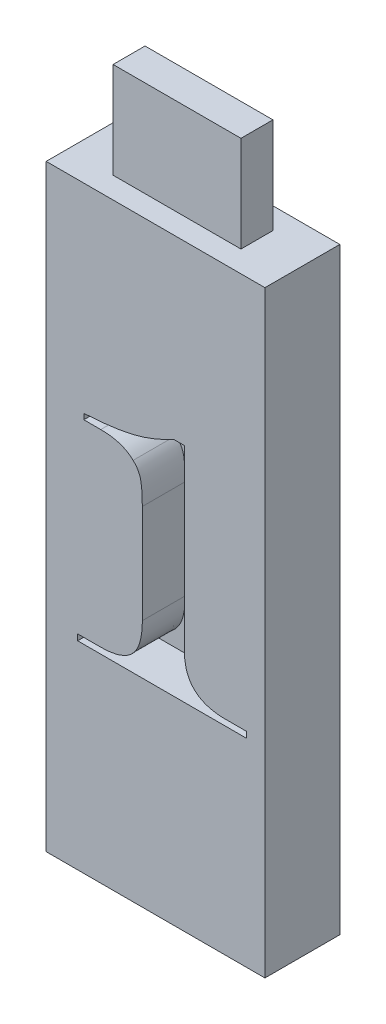
ISO-10303-21;
HEADER;
FILE_DESCRIPTION(('STEP AP214'),'2;1');
FILE_NAME('part.step','',(''),(''),'','','');
FILE_SCHEMA(('AUTOMOTIVE_DESIGN { 1 0 10303 214 1 1 1 1 }'));
ENDSEC;
DATA;
#1=APPLICATION_CONTEXT('core data for automotive mechanical design processes');
#2=APPLICATION_PROTOCOL_DEFINITION('international standard','automotive_design',2000,#1);
#3=PRODUCT_CONTEXT('',#1,'mechanical');
#4=PRODUCT('Part','Part','',(#3));
#5=PRODUCT_RELATED_PRODUCT_CATEGORY('part','',(#4));
#6=PRODUCT_DEFINITION_FORMATION('','',#4);
#7=PRODUCT_DEFINITION_CONTEXT('part definition',#1,'design');
#8=PRODUCT_DEFINITION('design','',#6,#7);
#9=PRODUCT_DEFINITION_SHAPE('','',#8);
#10=(LENGTH_UNIT() NAMED_UNIT(*) SI_UNIT(.MILLI.,.METRE.));
#11=(NAMED_UNIT(*) PLANE_ANGLE_UNIT() SI_UNIT($,.RADIAN.));
#12=(NAMED_UNIT(*) SI_UNIT($,.STERADIAN.) SOLID_ANGLE_UNIT());
#13=UNCERTAINTY_MEASURE_WITH_UNIT(LENGTH_MEASURE(1.E-05),#10,'distance_accuracy_value','');
#14=(GEOMETRIC_REPRESENTATION_CONTEXT(3) GLOBAL_UNCERTAINTY_ASSIGNED_CONTEXT((#13)) GLOBAL_UNIT_ASSIGNED_CONTEXT((#10,
#11,#12)) REPRESENTATION_CONTEXT('',''));
#15=CARTESIAN_POINT('',(0.,0.,0.));
#16=DIRECTION('',(0.,0.,1.));
#17=DIRECTION('',(1.,0.,0.));
#18=AXIS2_PLACEMENT_3D('',#15,#16,#17);
#19=CARTESIAN_POINT('',(-8.69,23.749,5.95));
#20=DIRECTION('',(0.,-1.,0.));
#21=DIRECTION('',(0.,0.,-1.));
#22=AXIS2_PLACEMENT_3D('',#19,#20,#21);
#23=PLANE('',#22);
#24=DIRECTION('',(-1.,0.,0.));
#25=VECTOR('',#24,1.);
#26=CARTESIAN_POINT('',(-8.69,23.749,0.));
#27=LINE('',#26,#25);
#28=CARTESIAN_POINT('',(8.69,23.749,0.));
#29=VERTEX_POINT('',#28);
#30=CARTESIAN_POINT('',(-8.69,23.749,0.));
#31=VERTEX_POINT('',#30);
#32=EDGE_CURVE('E284',#29,#31,#27,.T.);
#33=ORIENTED_EDGE('',*,*,#32,.T.);
#34=DIRECTION('',(0.,0.,-1.));
#35=VECTOR('',#34,1.);
#36=CARTESIAN_POINT('',(-8.69,23.749,5.95));
#37=LINE('',#36,#35);
#38=CARTESIAN_POINT('',(-8.69,23.749,5.95));
#39=VERTEX_POINT('',#38);
#40=EDGE_CURVE('E48',#39,#31,#37,.T.);
#41=ORIENTED_EDGE('',*,*,#40,.F.);
#42=DIRECTION('',(-1.,0.,0.));
#43=VECTOR('',#42,1.);
#44=CARTESIAN_POINT('',(-8.69,23.749,5.95));
#45=LINE('',#44,#43);
#46=CARTESIAN_POINT('',(8.69,23.749,5.95));
#47=VERTEX_POINT('',#46);
#48=EDGE_CURVE('E322',#47,#39,#45,.T.);
#49=ORIENTED_EDGE('',*,*,#48,.F.);
#50=DIRECTION('',(0.,0.,-1.));
#51=VECTOR('',#50,1.);
#52=CARTESIAN_POINT('',(8.69,23.749,5.95));
#53=LINE('',#52,#51);
#54=EDGE_CURVE('E11',#47,#29,#53,.T.);
#55=ORIENTED_EDGE('',*,*,#54,.T.);
#56=EDGE_LOOP('',(#33,#41,#49,#55));
#57=FACE_BOUND('',#56,.T.);
#58=DIRECTION('',(0.,0.,-1.));
#59=VECTOR('',#58,1.);
#60=CARTESIAN_POINT('',(5.08,23.749,4.245));
#61=LINE('',#60,#59);
#62=CARTESIAN_POINT('',(5.08,23.749,4.245));
#63=VERTEX_POINT('',#62);
#64=CARTESIAN_POINT('',(5.08,23.749,1.705));
#65=VERTEX_POINT('',#64);
#66=EDGE_CURVE('E55',#63,#65,#61,.T.);
#67=ORIENTED_EDGE('',*,*,#66,.F.);
#68=DIRECTION('',(1.,0.,0.));
#69=VECTOR('',#68,1.);
#70=CARTESIAN_POINT('',(-5.08,23.749,4.245));
#71=LINE('',#70,#69);
#72=CARTESIAN_POINT('',(-5.08,23.749,4.245));
#73=VERTEX_POINT('',#72);
#74=EDGE_CURVE('E59',#73,#63,#71,.T.);
#75=ORIENTED_EDGE('',*,*,#74,.F.);
#76=DIRECTION('',(0.,0.,1.));
#77=VECTOR('',#76,1.);
#78=CARTESIAN_POINT('',(-5.08,23.749,4.245));
#79=LINE('',#78,#77);
#80=CARTESIAN_POINT('',(-5.08,23.749,1.705));
#81=VERTEX_POINT('',#80);
#82=EDGE_CURVE('E787',#81,#73,#79,.T.);
#83=ORIENTED_EDGE('',*,*,#82,.F.);
#84=DIRECTION('',(-1.,0.,0.));
#85=VECTOR('',#84,1.);
#86=CARTESIAN_POINT('',(-5.08,23.749,1.705));
#87=LINE('',#86,#85);
#88=EDGE_CURVE('E797',#65,#81,#87,.T.);
#89=ORIENTED_EDGE('',*,*,#88,.F.);
#90=EDGE_LOOP('',(#67,#75,#83,#89));
#91=FACE_BOUND('',#90,.T.);
#92=ADVANCED_FACE('F39',(#57,#91),#23,.F.);
#93=CARTESIAN_POINT('',(0.,0.,5.95));
#94=DIRECTION('',(0.,0.,-1.));
#95=DIRECTION('',(-1.,0.,0.));
#96=AXIS2_PLACEMENT_3D('',#93,#94,#95);
#97=PLANE('',#96);
#98=DIRECTION('',(0.,1.,0.));
#99=VECTOR('',#98,1.);
#100=CARTESIAN_POINT('',(8.69,-23.749,5.95));
#101=LINE('',#100,#99);
#102=CARTESIAN_POINT('',(8.69,-23.749,5.95));
#103=VERTEX_POINT('',#102);
#104=EDGE_CURVE('E305',#103,#47,#101,.T.);
#105=ORIENTED_EDGE('',*,*,#104,.T.);
#106=ORIENTED_EDGE('',*,*,#48,.T.);
#107=DIRECTION('',(0.,-1.,0.));
#108=VECTOR('',#107,1.);
#109=CARTESIAN_POINT('',(-8.69,-23.749,5.95));
#110=LINE('',#109,#108);
#111=CARTESIAN_POINT('',(-8.69,-23.749,5.95));
#112=VERTEX_POINT('',#111);
#113=EDGE_CURVE('E297',#39,#112,#110,.T.);
#114=ORIENTED_EDGE('',*,*,#113,.T.);
#115=DIRECTION('',(1.,0.,0.));
#116=VECTOR('',#115,1.);
#117=CARTESIAN_POINT('',(-8.69,-23.749,5.95));
#118=LINE('',#117,#116);
#119=EDGE_CURVE('E313',#112,#103,#118,.T.);
#120=ORIENTED_EDGE('',*,*,#119,.T.);
#121=EDGE_LOOP('',(#105,#106,#114,#120));
#122=FACE_BOUND('',#121,.T.);
#123=DIRECTION('',(0.,1.,0.));
#124=VECTOR('',#123,1.);
#125=CARTESIAN_POINT('',(-6.18915076453345,-7.98771360499018,5.95));
#126=LINE('',#125,#124);
#127=CARTESIAN_POINT('',(-6.18915076453345,-7.98771360499018,5.95));
#128=VERTEX_POINT('',#127);
#129=CARTESIAN_POINT('',(-6.18915076453345,-7.51005577137531,5.95));
#130=VERTEX_POINT('',#129);
#131=EDGE_CURVE('E218',#128,#130,#126,.T.);
#132=ORIENTED_EDGE('',*,*,#131,.T.);
#133=DIRECTION('',(1.,0.,0.));
#134=VECTOR('',#133,1.);
#135=CARTESIAN_POINT('',(-6.18915076453345,-7.51005577137531,5.95));
#136=LINE('',#135,#134);
#137=CARTESIAN_POINT('',(-4.37554367752701,-7.51005577137531,5.95));
#138=VERTEX_POINT('',#137);
#139=EDGE_CURVE('E223',#130,#138,#136,.T.);
#140=ORIENTED_EDGE('',*,*,#139,.T.);
#141=CARTESIAN_POINT('',(-4.37554367752701,-7.51005577137531,5.95));
#142=CARTESIAN_POINT('',(-4.23610003430564,-7.50874102846015,5.95));
#143=CARTESIAN_POINT('',(-3.96525968570146,-7.50618741309811,5.95));
#144=CARTESIAN_POINT('',(-3.57515773941497,-7.46288098301774,5.95));
#145=CARTESIAN_POINT('',(-3.21292964680105,-7.40101134089906,5.95));
#146=CARTESIAN_POINT('',(-2.87995214816045,-7.31261869579678,5.95));
#147=CARTESIAN_POINT('',(-2.576880198355,-7.19594041634851,5.95));
#148=CARTESIAN_POINT('',(-2.29978761363573,-7.05947513325591,5.95));
#149=CARTESIAN_POINT('',(-2.05722729753765,-6.88939866376993,5.95));
#150=CARTESIAN_POINT('',(-1.83988617582516,-6.69689627341764,5.95));
#151=CARTESIAN_POINT('',(-1.65061730047412,-6.47374839688271,5.95));
#152=CARTESIAN_POINT('',(-1.49147228997212,-6.21688447837659,5.95));
#153=CARTESIAN_POINT('',(-1.35158271352618,-5.9313960282205,5.95));
#154=CARTESIAN_POINT('',(-1.24036571081079,-5.61174215076235,5.95));
#155=CARTESIAN_POINT('',(-1.15676772053177,-5.260026908282,5.95));
#156=CARTESIAN_POINT('',(-1.0930190540138,-4.87864815766317,5.95));
#157=CARTESIAN_POINT('',(-1.05562282296083,-4.46573757897142,5.95));
#158=CARTESIAN_POINT('',(-1.05231376730954,-4.18021236020088,5.95));
#159=CARTESIAN_POINT('',(-1.05059735134854,-4.03210967036708,5.95));
#160=B_SPLINE_CURVE_WITH_KNOTS('',3,(#141,#142,#143,#144,#145,#146,#147,#148,#149,#150,#151,
#152,#153,#154,#155,#156,#157,#158,#159),.UNSPECIFIED.,.F.,.F.,(4,1,1,1,1,1,1,1,1,1,1,1,1,1,1,1,
4),(0.,0.0750169889204133,0.145704938289554,0.210982199441047,0.272701169893458,
0.330771263795377,0.385568472334618,0.438501394808148,0.489712458530425,0.541493736534247,
0.595362705983791,0.651958867891753,0.712311685274751,0.777106425736709,0.846343012080092,
0.920297711982541,1.),.UNSPECIFIED.);
#161=CARTESIAN_POINT('',(-1.05059735134854,-4.03210967036708,5.95));
#162=VERTEX_POINT('',#161);
#163=EDGE_CURVE('E594',#138,#162,#160,.T.);
#164=ORIENTED_EDGE('',*,*,#163,.T.);
#165=DIRECTION('',(0.,1.,0.));
#166=VECTOR('',#165,1.);
#167=CARTESIAN_POINT('',(-1.05059735134854,-4.03210967036708,5.95));
#168=LINE('',#167,#166);
#169=CARTESIAN_POINT('',(-1.05059735134854,3.82312267150238,5.95));
#170=VERTEX_POINT('',#169);
#171=EDGE_CURVE('E600',#162,#170,#168,.T.);
#172=ORIENTED_EDGE('',*,*,#171,.T.);
#173=CARTESIAN_POINT('',(-1.05059735134854,3.82312267150238,5.95));
#174=CARTESIAN_POINT('',(-1.05099070588758,4.01847681535995,5.95));
#175=CARTESIAN_POINT('',(-1.05172286109474,4.38209167033187,5.95));
#176=CARTESIAN_POINT('',(-1.08281934121119,4.88372969077205,5.95));
#177=CARTESIAN_POINT('',(-1.12362186760334,5.30054430180468,5.95));
#178=CARTESIAN_POINT('',(-1.18631223309802,5.64251246196481,5.95));
#179=CARTESIAN_POINT('',(-1.27784933856357,5.93419420529454,5.95));
#180=CARTESIAN_POINT('',(-1.40985925874961,6.19089899772735,5.95));
#181=CARTESIAN_POINT('',(-1.57602629633835,6.42838762660998,5.95));
#182=CARTESIAN_POINT('',(-1.71261544534873,6.56412926713396,5.95));
#183=CARTESIAN_POINT('',(-1.7820109090713,6.63309414581483,5.95));
#184=B_SPLINE_CURVE_WITH_KNOTS('',3,(#173,#174,#175,#176,#177,#178,#179,#180,#181,#182,#183),
.UNSPECIFIED.,.F.,.F.,(4,1,1,1,1,1,1,1,4),(0.,0.195476440494539,0.363842487071439,
0.502839566722221,0.614422665441608,0.711274754792311,0.807597286873265,0.902247904788573,1.),.UNSPECIFIED.);
#185=CARTESIAN_POINT('',(-1.7820109090713,6.63309414581483,5.95));
#186=VERTEX_POINT('',#185);
#187=EDGE_CURVE('E607',#170,#186,#184,.T.);
#188=ORIENTED_EDGE('',*,*,#187,.T.);
#189=CARTESIAN_POINT('',(-1.7820109090713,6.63309414581483,5.95));
#190=CARTESIAN_POINT('',(-1.85786908165485,6.69933454417018,5.95));
#191=CARTESIAN_POINT('',(-2.01068954560201,6.83277947256678,5.95));
#192=CARTESIAN_POINT('',(-2.26657065487001,7.00693233106887,5.95));
#193=CARTESIAN_POINT('',(-2.55272251106501,7.14773373539934,5.95));
#194=CARTESIAN_POINT('',(-2.8637657441885,7.26143162650499,5.95));
#195=CARTESIAN_POINT('',(-3.1983525879004,7.35833861437856,5.95));
#196=CARTESIAN_POINT('',(-3.56050980183189,7.41658275676326,5.95));
#197=CARTESIAN_POINT('',(-3.94775190459175,7.46185027267119,5.95));
#198=CARTESIAN_POINT('',(-4.21492627116966,7.46409981427025,5.95));
#199=CARTESIAN_POINT('',(-4.35315346657631,7.46526365281573,5.95));
#200=B_SPLINE_CURVE_WITH_KNOTS('',3,(#189,#190,#191,#192,#193,#194,#195,#196,#197,#198,#199),
.UNSPECIFIED.,.F.,.F.,(4,1,1,1,1,1,1,1,4),(0.,0.109036045176578,0.219659114415069,
0.334153543090579,0.453538768546203,0.578104103389299,0.71079980205562,0.850377366717769,1.),.UNSPECIFIED.);
#201=CARTESIAN_POINT('',(-4.35315346657631,7.46526365281573,5.95));
#202=VERTEX_POINT('',#201);
#203=EDGE_CURVE('E613',#186,#202,#200,.T.);
#204=ORIENTED_EDGE('',*,*,#203,.T.);
#205=DIRECTION('',(-1.,0.,0.));
#206=VECTOR('',#205,1.);
#207=CARTESIAN_POINT('',(-4.35315346657631,7.46526365281573,5.95));
#208=LINE('',#207,#206);
#209=CARTESIAN_POINT('',(-5.70029782544324,7.46526365281573,5.95));
#210=VERTEX_POINT('',#209);
#211=EDGE_CURVE('E622',#202,#210,#208,.T.);
#212=ORIENTED_EDGE('',*,*,#211,.T.);
#213=DIRECTION('',(0.,1.,0.));
#214=VECTOR('',#213,1.);
#215=CARTESIAN_POINT('',(-5.70029782544324,7.46526365281573,5.95));
#216=LINE('',#215,#214);
#217=CARTESIAN_POINT('',(-5.70029782544324,7.90933617000454,5.95));
#218=VERTEX_POINT('',#217);
#219=EDGE_CURVE('E629',#210,#218,#216,.T.);
#220=ORIENTED_EDGE('',*,*,#219,.T.);
#221=CARTESIAN_POINT('',(-5.70029782544324,7.90933617000454,5.95));
#222=CARTESIAN_POINT('',(-5.45143047737275,7.9229585992943,5.95));
#223=CARTESIAN_POINT('',(-4.9669659583837,7.94947707873523,5.95));
#224=CARTESIAN_POINT('',(-4.25899913030741,8.01002373821412,5.95));
#225=CARTESIAN_POINT('',(-3.58940796363513,8.08356334657333,5.95));
#226=CARTESIAN_POINT('',(-2.95443418659469,8.17279995438616,5.95));
#227=CARTESIAN_POINT('',(-2.35298840335099,8.28028574755233,5.95));
#228=CARTESIAN_POINT('',(-1.78214454984667,8.40826926657247,5.95));
#229=CARTESIAN_POINT('',(-1.23801095244961,8.54797874094322,5.95));
#230=CARTESIAN_POINT('',(-0.715430391819257,8.71553333176158,5.95));
#231=CARTESIAN_POINT('',(-0.195727601763085,8.91037522080877,5.95));
#232=CARTESIAN_POINT('',(0.33741676027381,9.13230690572563,5.95));
#233=CARTESIAN_POINT('',(0.886154118734322,9.39705878987949,5.95));
#234=CARTESIAN_POINT('',(1.25603834429261,9.58774249305935,5.95));
#235=CARTESIAN_POINT('',(1.44591116965416,9.68562623875982,5.95));
#236=B_SPLINE_CURVE_WITH_KNOTS('',3,(#221,#222,#223,#224,#225,#226,#227,#228,#229,#230,#231,
#232,#233,#234,#235),.UNSPECIFIED.,.F.,.F.,(4,1,1,1,1,1,1,1,1,1,1,1,4),(0.,0.100545978385056,
0.195730614852711,0.286615425000165,0.372275174389162,0.454369599448173,0.533022142066202,
0.608244380805138,0.680931444364636,0.754290991819458,0.832113082458704,0.913818537877107,1.),.UNSPECIFIED.);
#237=CARTESIAN_POINT('',(1.44591116965416,9.68562623875982,5.95));
#238=VERTEX_POINT('',#237);
#239=EDGE_CURVE('E633',#218,#238,#236,.T.);
#240=ORIENTED_EDGE('',*,*,#239,.T.);
#241=DIRECTION('',(1.,0.,0.));
#242=VECTOR('',#241,1.);
#243=CARTESIAN_POINT('',(1.44591116965416,9.68562623875982,5.95));
#244=LINE('',#243,#242);
#245=CARTESIAN_POINT('',(2.29300748395552,9.68562623875982,5.95));
#246=VERTEX_POINT('',#245);
#247=EDGE_CURVE('E639',#238,#246,#244,.T.);
#248=ORIENTED_EDGE('',*,*,#247,.T.);
#249=DIRECTION('',(0.,-1.,0.));
#250=VECTOR('',#249,1.);
#251=CARTESIAN_POINT('',(2.29300748395552,9.68562623875982,5.95));
#252=LINE('',#251,#250);
#253=CARTESIAN_POINT('',(2.29300748395552,-4.45752367843031,5.95));
#254=VERTEX_POINT('',#253);
#255=EDGE_CURVE('E646',#246,#254,#252,.T.);
#256=ORIENTED_EDGE('',*,*,#255,.T.);
#257=CARTESIAN_POINT('',(2.29300748395552,-4.45752367843031,5.95));
#258=CARTESIAN_POINT('',(2.29431731137845,-4.58081526710359,5.95));
#259=CARTESIAN_POINT('',(2.29686559135136,-4.82068006207079,5.95));
#260=CARTESIAN_POINT('',(2.34058462423329,-5.16726640645375,5.95));
#261=CARTESIAN_POINT('',(2.40232489771927,-5.49108335297564,5.95));
#262=CARTESIAN_POINT('',(2.49085280621763,-5.790612797527,5.95));
#263=CARTESIAN_POINT('',(2.60846598670943,-6.0646716034722,5.95));
#264=CARTESIAN_POINT('',(2.74585186833221,-6.31865292130383,5.95));
#265=CARTESIAN_POINT('',(2.91446779534326,-6.5469008701421,5.95));
#266=CARTESIAN_POINT('',(3.11089720268626,-6.74900946449629,5.95));
#267=CARTESIAN_POINT('',(3.32916805728572,-6.93021895527735,5.95));
#268=CARTESIAN_POINT('',(3.57280886211807,-7.08810541957417,5.95));
#269=CARTESIAN_POINT('',(3.84456582059356,-7.21780194668013,5.95));
#270=CARTESIAN_POINT('',(4.14019436166815,-7.32714773974292,5.95));
#271=CARTESIAN_POINT('',(4.462230563453,-7.407047665968,5.95));
#272=CARTESIAN_POINT('',(4.80887042532651,-7.46684323463618,5.95));
#273=CARTESIAN_POINT('',(5.18049461877157,-7.50499436729588,5.95));
#274=CARTESIAN_POINT('',(5.43749333132193,-7.50833871525566,5.95));
#275=CARTESIAN_POINT('',(5.56944168640748,-7.51005577137531,5.95));
#276=B_SPLINE_CURVE_WITH_KNOTS('',3,(#257,#258,#259,#260,#261,#262,#263,#264,#265,#266,#267,
#268,#269,#270,#271,#272,#273,#274,#275),.UNSPECIFIED.,.F.,.F.,(4,1,1,1,1,1,1,1,1,1,1,1,1,1,1,1,
4),(0.,0.0719768539852749,0.140031558594914,0.203737552029851,0.264433764671674,
0.322068417215544,0.377688680494232,0.432774671570647,0.487253343812736,0.541964170539376,
0.598202901624974,0.656380192321752,0.717535804487765,0.78204497615295,0.849905404874899,
0.922938388533331,1.),.UNSPECIFIED.);
#277=CARTESIAN_POINT('',(5.56944168640748,-7.51005577137531,5.95));
#278=VERTEX_POINT('',#277);
#279=EDGE_CURVE('E650',#254,#278,#276,.T.);
#280=ORIENTED_EDGE('',*,*,#279,.T.);
#281=DIRECTION('',(1.,0.,0.));
#282=VECTOR('',#281,1.);
#283=CARTESIAN_POINT('',(5.56944168640748,-7.51005577137531,5.95));
#284=LINE('',#283,#282);
#285=CARTESIAN_POINT('',(7.24497580588462,-7.51005577137531,5.95));
#286=VERTEX_POINT('',#285);
#287=EDGE_CURVE('E656',#278,#286,#284,.T.);
#288=ORIENTED_EDGE('',*,*,#287,.T.);
#289=DIRECTION('',(0.,-1.,0.));
#290=VECTOR('',#289,1.);
#291=CARTESIAN_POINT('',(7.24497580588462,-7.51005577137531,5.95));
#292=LINE('',#291,#290);
#293=CARTESIAN_POINT('',(7.24497580588462,-7.98771360499018,5.95));
#294=VERTEX_POINT('',#293);
#295=EDGE_CURVE('E663',#286,#294,#292,.T.);
#296=ORIENTED_EDGE('',*,*,#295,.T.);
#297=DIRECTION('',(-1.,0.,0.));
#298=VECTOR('',#297,1.);
#299=CARTESIAN_POINT('',(7.24497580588462,-7.98771360499018,5.95));
#300=LINE('',#299,#298);
#301=EDGE_CURVE('E234',#294,#128,#300,.T.);
#302=ORIENTED_EDGE('',*,*,#301,.T.);
#303=EDGE_LOOP('',(#132,#140,#164,#172,#188,#204,#212,#220,#240,#248,#256,#280,#288,#296,#302));
#304=FACE_BOUND('',#303,.T.);
#305=ADVANCED_FACE('F265',(#122,#304),#97,.F.);
#306=CARTESIAN_POINT('',(8.69,-23.749,5.95));
#307=DIRECTION('',(-1.,0.,0.));
#308=DIRECTION('',(0.,0.,1.));
#309=AXIS2_PLACEMENT_3D('',#306,#307,#308);
#310=PLANE('',#309);
#311=DIRECTION('',(0.,1.,0.));
#312=VECTOR('',#311,1.);
#313=CARTESIAN_POINT('',(8.69,-23.749,0.));
#314=LINE('',#313,#312);
#315=CARTESIAN_POINT('',(8.69,-23.749,0.));
#316=VERTEX_POINT('',#315);
#317=EDGE_CURVE('E293',#316,#29,#314,.T.);
#318=ORIENTED_EDGE('',*,*,#317,.T.);
#319=ORIENTED_EDGE('',*,*,#54,.F.);
#320=ORIENTED_EDGE('',*,*,#104,.F.);
#321=DIRECTION('',(0.,0.,-1.));
#322=VECTOR('',#321,1.);
#323=CARTESIAN_POINT('',(8.69,-23.749,5.95));
#324=LINE('',#323,#322);
#325=EDGE_CURVE('E309',#103,#316,#324,.T.);
#326=ORIENTED_EDGE('',*,*,#325,.T.);
#327=EDGE_LOOP('',(#318,#319,#320,#326));
#328=FACE_BOUND('',#327,.T.);
#329=ADVANCED_FACE('F41',(#328),#310,.F.);
#330=CARTESIAN_POINT('',(-8.69,-23.749,5.95));
#331=DIRECTION('',(1.,0.,0.));
#332=DIRECTION('',(0.,0.,-1.));
#333=AXIS2_PLACEMENT_3D('',#330,#331,#332);
#334=PLANE('',#333);
#335=DIRECTION('',(0.,-1.,0.));
#336=VECTOR('',#335,1.);
#337=CARTESIAN_POINT('',(-8.69,-23.749,0.));
#338=LINE('',#337,#336);
#339=CARTESIAN_POINT('',(-8.69,-23.749,0.));
#340=VERTEX_POINT('',#339);
#341=EDGE_CURVE('E292',#31,#340,#338,.T.);
#342=ORIENTED_EDGE('',*,*,#341,.T.);
#343=DIRECTION('',(0.,0.,-1.));
#344=VECTOR('',#343,1.);
#345=CARTESIAN_POINT('',(-8.69,-23.749,5.95));
#346=LINE('',#345,#344);
#347=EDGE_CURVE('E299',#112,#340,#346,.T.);
#348=ORIENTED_EDGE('',*,*,#347,.F.);
#349=ORIENTED_EDGE('',*,*,#113,.F.);
#350=ORIENTED_EDGE('',*,*,#40,.T.);
#351=EDGE_LOOP('',(#342,#348,#349,#350));
#352=FACE_BOUND('',#351,.T.);
#353=ADVANCED_FACE('F275',(#352),#334,.F.);
#354=CARTESIAN_POINT('',(-8.69,-23.749,5.95));
#355=DIRECTION('',(0.,1.,0.));
#356=DIRECTION('',(0.,0.,1.));
#357=AXIS2_PLACEMENT_3D('',#354,#355,#356);
#358=PLANE('',#357);
#359=DIRECTION('',(1.,0.,0.));
#360=VECTOR('',#359,1.);
#361=CARTESIAN_POINT('',(-8.69,-23.749,0.));
#362=LINE('',#361,#360);
#363=EDGE_CURVE('E301',#340,#316,#362,.T.);
#364=ORIENTED_EDGE('',*,*,#363,.T.);
#365=ORIENTED_EDGE('',*,*,#325,.F.);
#366=ORIENTED_EDGE('',*,*,#119,.F.);
#367=ORIENTED_EDGE('',*,*,#347,.T.);
#368=EDGE_LOOP('',(#364,#365,#366,#367));
#369=FACE_BOUND('',#368,.T.);
#370=ADVANCED_FACE('F271',(#369),#358,.F.);
#371=CARTESIAN_POINT('',(0.,0.,0.));
#372=DIRECTION('',(0.,0.,-1.));
#373=DIRECTION('',(-1.,0.,0.));
#374=AXIS2_PLACEMENT_3D('',#371,#372,#373);
#375=PLANE('',#374);
#376=ORIENTED_EDGE('',*,*,#317,.F.);
#377=ORIENTED_EDGE('',*,*,#363,.F.);
#378=ORIENTED_EDGE('',*,*,#341,.F.);
#379=ORIENTED_EDGE('',*,*,#32,.F.);
#380=EDGE_LOOP('',(#376,#377,#378,#379));
#381=FACE_BOUND('',#380,.T.);
#382=ADVANCED_FACE('F263',(#381),#375,.T.);
#383=CARTESIAN_POINT('',(-6.18915076453345,-7.98771360499018,2.54));
#384=DIRECTION('',(1.,0.,0.));
#385=DIRECTION('',(0.,0.,-1.));
#386=AXIS2_PLACEMENT_3D('',#383,#384,#385);
#387=PLANE('',#386);
#388=ORIENTED_EDGE('',*,*,#131,.F.);
#389=DIRECTION('',(0.,0.,1.));
#390=VECTOR('',#389,1.);
#391=CARTESIAN_POINT('',(-6.18915076453345,-7.98771360499018,2.54));
#392=LINE('',#391,#390);
#393=CARTESIAN_POINT('',(-6.18915076453345,-7.98771360499018,2.54));
#394=VERTEX_POINT('',#393);
#395=EDGE_CURVE('E589',#394,#128,#392,.T.);
#396=ORIENTED_EDGE('',*,*,#395,.F.);
#397=DIRECTION('',(0.,1.,0.));
#398=VECTOR('',#397,1.);
#399=CARTESIAN_POINT('',(-6.18915076453345,-7.98771360499018,2.54));
#400=LINE('',#399,#398);
#401=CARTESIAN_POINT('',(-6.18915076453345,-7.51005577137531,2.54));
#402=VERTEX_POINT('',#401);
#403=EDGE_CURVE('E229',#394,#402,#400,.T.);
#404=ORIENTED_EDGE('',*,*,#403,.T.);
#405=DIRECTION('',(0.,0.,1.));
#406=VECTOR('',#405,1.);
#407=CARTESIAN_POINT('',(-6.18915076453345,-7.51005577137531,2.54));
#408=LINE('',#407,#406);
#409=EDGE_CURVE('E326',#402,#130,#408,.T.);
#410=ORIENTED_EDGE('',*,*,#409,.T.);
#411=EDGE_LOOP('',(#388,#396,#404,#410));
#412=FACE_BOUND('',#411,.T.);
#413=ADVANCED_FACE('F259',(#412),#387,.T.);
#414=CARTESIAN_POINT('',(-6.18915076453345,-7.51005577137531,2.54));
#415=DIRECTION('',(0.,-1.,0.));
#416=DIRECTION('',(0.,0.,-1.));
#417=AXIS2_PLACEMENT_3D('',#414,#415,#416);
#418=PLANE('',#417);
#419=ORIENTED_EDGE('',*,*,#139,.F.);
#420=ORIENTED_EDGE('',*,*,#409,.F.);
#421=DIRECTION('',(1.,0.,0.));
#422=VECTOR('',#421,1.);
#423=CARTESIAN_POINT('',(-6.18915076453345,-7.51005577137531,2.54));
#424=LINE('',#423,#422);
#425=CARTESIAN_POINT('',(-4.37554367752701,-7.51005577137531,2.54));
#426=VERTEX_POINT('',#425);
#427=EDGE_CURVE('E233',#402,#426,#424,.T.);
#428=ORIENTED_EDGE('',*,*,#427,.T.);
#429=DIRECTION('',(0.,0.,1.));
#430=VECTOR('',#429,1.);
#431=CARTESIAN_POINT('',(-4.37554367752701,-7.51005577137531,2.54));
#432=LINE('',#431,#430);
#433=EDGE_CURVE('E330',#426,#138,#432,.T.);
#434=ORIENTED_EDGE('',*,*,#433,.T.);
#435=EDGE_LOOP('',(#419,#420,#428,#434));
#436=FACE_BOUND('',#435,.T.);
#437=ADVANCED_FACE('F254',(#436),#418,.T.);
#438=CARTESIAN_POINT('',(-4.37554367752701,-7.51005577137531,2.54));
#439=CARTESIAN_POINT('',(-4.23610003430564,-7.50874102846015,2.54));
#440=CARTESIAN_POINT('',(-3.96525968570146,-7.50618741309811,2.54));
#441=CARTESIAN_POINT('',(-3.57515773941497,-7.46288098301774,2.54));
#442=CARTESIAN_POINT('',(-3.21292964680105,-7.40101134089906,2.54));
#443=CARTESIAN_POINT('',(-2.87995214816045,-7.31261869579678,2.54));
#444=CARTESIAN_POINT('',(-2.576880198355,-7.19594041634851,2.54));
#445=CARTESIAN_POINT('',(-2.29978761363573,-7.05947513325591,2.54));
#446=CARTESIAN_POINT('',(-2.05722729753765,-6.88939866376993,2.54));
#447=CARTESIAN_POINT('',(-1.83988617582516,-6.69689627341764,2.54));
#448=CARTESIAN_POINT('',(-1.65061730047412,-6.47374839688271,2.54));
#449=CARTESIAN_POINT('',(-1.49147228997212,-6.21688447837659,2.54));
#450=CARTESIAN_POINT('',(-1.35158271352618,-5.9313960282205,2.54));
#451=CARTESIAN_POINT('',(-1.24036571081079,-5.61174215076235,2.54));
#452=CARTESIAN_POINT('',(-1.15676772053177,-5.260026908282,2.54));
#453=CARTESIAN_POINT('',(-1.0930190540138,-4.87864815766317,2.54));
#454=CARTESIAN_POINT('',(-1.05562282296083,-4.46573757897142,2.54));
#455=CARTESIAN_POINT('',(-1.05231376730954,-4.18021236020088,2.54));
#456=CARTESIAN_POINT('',(-1.05059735134854,-4.03210967036708,2.54));
#457=B_SPLINE_CURVE_WITH_KNOTS('',3,(#438,#439,#440,#441,#442,#443,#444,#445,#446,#447,#448,
#449,#450,#451,#452,#453,#454,#455,#456),.UNSPECIFIED.,.F.,.F.,(4,1,1,1,1,1,1,1,1,1,1,1,1,1,1,1,
4),(0.,0.0750169889204133,0.145704938289554,0.210982199441047,0.272701169893458,
0.330771263795377,0.385568472334618,0.438501394808148,0.489712458530425,0.541493736534247,
0.595362705983791,0.651958867891753,0.712311685274751,0.777106425736709,0.846343012080092,
0.920297711982541,1.),.UNSPECIFIED.);
#458=DIRECTION('',(0.,0.,1.));
#459=VECTOR('',#458,1.);
#460=SURFACE_OF_LINEAR_EXTRUSION('',#457,#459);
#461=ORIENTED_EDGE('',*,*,#163,.F.);
#462=ORIENTED_EDGE('',*,*,#433,.F.);
#463=CARTESIAN_POINT('',(-1.05059735134854,-4.03210967036708,2.54));
#464=VERTEX_POINT('',#463);
#465=EDGE_CURVE('E237',#426,#464,#457,.T.);
#466=ORIENTED_EDGE('',*,*,#465,.T.);
#467=DIRECTION('',(0.,0.,1.));
#468=VECTOR('',#467,1.);
#469=CARTESIAN_POINT('',(-1.05059735134854,-4.03210967036708,2.54));
#470=LINE('',#469,#468);
#471=EDGE_CURVE('E334',#464,#162,#470,.T.);
#472=ORIENTED_EDGE('',*,*,#471,.T.);
#473=EDGE_LOOP('',(#461,#462,#466,#472));
#474=FACE_BOUND('',#473,.T.);
#475=ADVANCED_FACE('F249',(#474),#460,.T.);
#476=CARTESIAN_POINT('',(-1.05059735134854,-4.03210967036708,2.54));
#477=DIRECTION('',(1.,0.,0.));
#478=DIRECTION('',(0.,0.,-1.));
#479=AXIS2_PLACEMENT_3D('',#476,#477,#478);
#480=PLANE('',#479);
#481=ORIENTED_EDGE('',*,*,#171,.F.);
#482=ORIENTED_EDGE('',*,*,#471,.F.);
#483=DIRECTION('',(0.,1.,0.));
#484=VECTOR('',#483,1.);
#485=CARTESIAN_POINT('',(-1.05059735134854,-4.03210967036708,2.54));
#486=LINE('',#485,#484);
#487=CARTESIAN_POINT('',(-1.05059735134854,3.82312267150238,2.54));
#488=VERTEX_POINT('',#487);
#489=EDGE_CURVE('E243',#464,#488,#486,.T.);
#490=ORIENTED_EDGE('',*,*,#489,.T.);
#491=DIRECTION('',(0.,0.,1.));
#492=VECTOR('',#491,1.);
#493=CARTESIAN_POINT('',(-1.05059735134854,3.82312267150238,2.54));
#494=LINE('',#493,#492);
#495=EDGE_CURVE('E703',#488,#170,#494,.T.);
#496=ORIENTED_EDGE('',*,*,#495,.T.);
#497=EDGE_LOOP('',(#481,#482,#490,#496));
#498=FACE_BOUND('',#497,.T.);
#499=ADVANCED_FACE('F253',(#498),#480,.T.);
#500=CARTESIAN_POINT('',(-1.05059735134854,3.82312267150238,2.54));
#501=CARTESIAN_POINT('',(-1.05099070588758,4.01847681535995,2.54));
#502=CARTESIAN_POINT('',(-1.05172286109474,4.38209167033187,2.54));
#503=CARTESIAN_POINT('',(-1.08281934121119,4.88372969077205,2.54));
#504=CARTESIAN_POINT('',(-1.12362186760334,5.30054430180468,2.54));
#505=CARTESIAN_POINT('',(-1.18631223309802,5.64251246196481,2.54));
#506=CARTESIAN_POINT('',(-1.27784933856357,5.93419420529454,2.54));
#507=CARTESIAN_POINT('',(-1.40985925874961,6.19089899772735,2.54));
#508=CARTESIAN_POINT('',(-1.57602629633835,6.42838762660998,2.54));
#509=CARTESIAN_POINT('',(-1.71261544534873,6.56412926713396,2.54));
#510=CARTESIAN_POINT('',(-1.7820109090713,6.63309414581483,2.54));
#511=B_SPLINE_CURVE_WITH_KNOTS('',3,(#500,#501,#502,#503,#504,#505,#506,#507,#508,#509,#510),
.UNSPECIFIED.,.F.,.F.,(4,1,1,1,1,1,1,1,4),(0.,0.195476440494539,0.363842487071439,
0.502839566722221,0.614422665441608,0.711274754792311,0.807597286873265,0.902247904788573,1.),.UNSPECIFIED.);
#512=DIRECTION('',(0.,0.,1.));
#513=VECTOR('',#512,1.);
#514=SURFACE_OF_LINEAR_EXTRUSION('',#511,#513);
#515=ORIENTED_EDGE('',*,*,#187,.F.);
#516=ORIENTED_EDGE('',*,*,#495,.F.);
#517=CARTESIAN_POINT('',(-1.7820109090713,6.63309414581483,2.54));
#518=VERTEX_POINT('',#517);
#519=EDGE_CURVE('E717',#488,#518,#511,.T.);
#520=ORIENTED_EDGE('',*,*,#519,.T.);
#521=DIRECTION('',(0.,0.,1.));
#522=VECTOR('',#521,1.);
#523=CARTESIAN_POINT('',(-1.7820109090713,6.63309414581483,2.54));
#524=LINE('',#523,#522);
#525=EDGE_CURVE('E700',#518,#186,#524,.T.);
#526=ORIENTED_EDGE('',*,*,#525,.T.);
#527=EDGE_LOOP('',(#515,#516,#520,#526));
#528=FACE_BOUND('',#527,.T.);
#529=ADVANCED_FACE('F376',(#528),#514,.T.);
#530=CARTESIAN_POINT('',(-1.7820109090713,6.63309414581483,2.54));
#531=CARTESIAN_POINT('',(-1.85786908165485,6.69933454417018,2.54));
#532=CARTESIAN_POINT('',(-2.01068954560201,6.83277947256678,2.54));
#533=CARTESIAN_POINT('',(-2.26657065487001,7.00693233106887,2.54));
#534=CARTESIAN_POINT('',(-2.55272251106501,7.14773373539934,2.54));
#535=CARTESIAN_POINT('',(-2.8637657441885,7.26143162650499,2.54));
#536=CARTESIAN_POINT('',(-3.1983525879004,7.35833861437856,2.54));
#537=CARTESIAN_POINT('',(-3.56050980183189,7.41658275676326,2.54));
#538=CARTESIAN_POINT('',(-3.94775190459175,7.46185027267119,2.54));
#539=CARTESIAN_POINT('',(-4.21492627116966,7.46409981427025,2.54));
#540=CARTESIAN_POINT('',(-4.35315346657631,7.46526365281573,2.54));
#541=B_SPLINE_CURVE_WITH_KNOTS('',3,(#530,#531,#532,#533,#534,#535,#536,#537,#538,#539,#540),
.UNSPECIFIED.,.F.,.F.,(4,1,1,1,1,1,1,1,4),(0.,0.109036045176578,0.219659114415069,
0.334153543090579,0.453538768546203,0.578104103389299,0.71079980205562,0.850377366717769,1.),.UNSPECIFIED.);
#542=DIRECTION('',(0.,0.,1.));
#543=VECTOR('',#542,1.);
#544=SURFACE_OF_LINEAR_EXTRUSION('',#541,#543);
#545=ORIENTED_EDGE('',*,*,#203,.F.);
#546=ORIENTED_EDGE('',*,*,#525,.F.);
#547=CARTESIAN_POINT('',(-4.35315346657631,7.46526365281573,2.54));
#548=VERTEX_POINT('',#547);
#549=EDGE_CURVE('E720',#518,#548,#541,.T.);
#550=ORIENTED_EDGE('',*,*,#549,.T.);
#551=DIRECTION('',(0.,0.,1.));
#552=VECTOR('',#551,1.);
#553=CARTESIAN_POINT('',(-4.35315346657631,7.46526365281573,2.54));
#554=LINE('',#553,#552);
#555=EDGE_CURVE('E697',#548,#202,#554,.T.);
#556=ORIENTED_EDGE('',*,*,#555,.T.);
#557=EDGE_LOOP('',(#545,#546,#550,#556));
#558=FACE_BOUND('',#557,.T.);
#559=ADVANCED_FACE('F383',(#558),#544,.T.);
#560=CARTESIAN_POINT('',(-4.35315346657631,7.46526365281573,2.54));
#561=DIRECTION('',(0.,1.,0.));
#562=DIRECTION('',(0.,0.,1.));
#563=AXIS2_PLACEMENT_3D('',#560,#561,#562);
#564=PLANE('',#563);
#565=ORIENTED_EDGE('',*,*,#211,.F.);
#566=ORIENTED_EDGE('',*,*,#555,.F.);
#567=DIRECTION('',(-1.,0.,0.));
#568=VECTOR('',#567,1.);
#569=CARTESIAN_POINT('',(-4.35315346657631,7.46526365281573,2.54));
#570=LINE('',#569,#568);
#571=CARTESIAN_POINT('',(-5.70029782544324,7.46526365281573,2.54));
#572=VERTEX_POINT('',#571);
#573=EDGE_CURVE('E723',#548,#572,#570,.T.);
#574=ORIENTED_EDGE('',*,*,#573,.T.);
#575=DIRECTION('',(0.,0.,1.));
#576=VECTOR('',#575,1.);
#577=CARTESIAN_POINT('',(-5.70029782544324,7.46526365281573,2.54));
#578=LINE('',#577,#576);
#579=EDGE_CURVE('E694',#572,#210,#578,.T.);
#580=ORIENTED_EDGE('',*,*,#579,.T.);
#581=EDGE_LOOP('',(#565,#566,#574,#580));
#582=FACE_BOUND('',#581,.T.);
#583=ADVANCED_FACE('F390',(#582),#564,.T.);
#584=CARTESIAN_POINT('',(-5.70029782544324,7.46526365281573,2.54));
#585=DIRECTION('',(1.,0.,0.));
#586=DIRECTION('',(0.,0.,-1.));
#587=AXIS2_PLACEMENT_3D('',#584,#585,#586);
#588=PLANE('',#587);
#589=ORIENTED_EDGE('',*,*,#219,.F.);
#590=ORIENTED_EDGE('',*,*,#579,.F.);
#591=DIRECTION('',(0.,1.,0.));
#592=VECTOR('',#591,1.);
#593=CARTESIAN_POINT('',(-5.70029782544324,7.46526365281573,2.54));
#594=LINE('',#593,#592);
#595=CARTESIAN_POINT('',(-5.70029782544324,7.90933617000454,2.54));
#596=VERTEX_POINT('',#595);
#597=EDGE_CURVE('E743',#572,#596,#594,.T.);
#598=ORIENTED_EDGE('',*,*,#597,.T.);
#599=DIRECTION('',(0.,0.,1.));
#600=VECTOR('',#599,1.);
#601=CARTESIAN_POINT('',(-5.70029782544324,7.90933617000454,2.54));
#602=LINE('',#601,#600);
#603=EDGE_CURVE('E691',#596,#218,#602,.T.);
#604=ORIENTED_EDGE('',*,*,#603,.T.);
#605=EDGE_LOOP('',(#589,#590,#598,#604));
#606=FACE_BOUND('',#605,.T.);
#607=ADVANCED_FACE('F398',(#606),#588,.T.);
#608=CARTESIAN_POINT('',(-5.70029782544324,7.90933617000454,2.54));
#609=CARTESIAN_POINT('',(-5.45143047737275,7.9229585992943,2.54));
#610=CARTESIAN_POINT('',(-4.9669659583837,7.94947707873523,2.54));
#611=CARTESIAN_POINT('',(-4.25899913030741,8.01002373821412,2.54));
#612=CARTESIAN_POINT('',(-3.58940796363513,8.08356334657333,2.54));
#613=CARTESIAN_POINT('',(-2.95443418659469,8.17279995438616,2.54));
#614=CARTESIAN_POINT('',(-2.35298840335099,8.28028574755233,2.54));
#615=CARTESIAN_POINT('',(-1.78214454984667,8.40826926657247,2.54));
#616=CARTESIAN_POINT('',(-1.23801095244961,8.54797874094322,2.54));
#617=CARTESIAN_POINT('',(-0.715430391819257,8.71553333176158,2.54));
#618=CARTESIAN_POINT('',(-0.195727601763085,8.91037522080877,2.54));
#619=CARTESIAN_POINT('',(0.33741676027381,9.13230690572563,2.54));
#620=CARTESIAN_POINT('',(0.886154118734322,9.39705878987949,2.54));
#621=CARTESIAN_POINT('',(1.25603834429261,9.58774249305935,2.54));
#622=CARTESIAN_POINT('',(1.44591116965416,9.68562623875982,2.54));
#623=B_SPLINE_CURVE_WITH_KNOTS('',3,(#608,#609,#610,#611,#612,#613,#614,#615,#616,#617,#618,
#619,#620,#621,#622),.UNSPECIFIED.,.F.,.F.,(4,1,1,1,1,1,1,1,1,1,1,1,4),(0.,0.100545978385056,
0.195730614852711,0.286615425000165,0.372275174389162,0.454369599448173,0.533022142066202,
0.608244380805138,0.680931444364636,0.754290991819458,0.832113082458704,0.913818537877107,1.),.UNSPECIFIED.);
#624=DIRECTION('',(0.,0.,1.));
#625=VECTOR('',#624,1.);
#626=SURFACE_OF_LINEAR_EXTRUSION('',#623,#625);
#627=ORIENTED_EDGE('',*,*,#239,.F.);
#628=ORIENTED_EDGE('',*,*,#603,.F.);
#629=CARTESIAN_POINT('',(1.44591116965416,9.68562623875982,2.54));
#630=VERTEX_POINT('',#629);
#631=EDGE_CURVE('E736',#596,#630,#623,.T.);
#632=ORIENTED_EDGE('',*,*,#631,.T.);
#633=DIRECTION('',(0.,0.,1.));
#634=VECTOR('',#633,1.);
#635=CARTESIAN_POINT('',(1.44591116965416,9.68562623875982,2.54));
#636=LINE('',#635,#634);
#637=EDGE_CURVE('E688',#630,#238,#636,.T.);
#638=ORIENTED_EDGE('',*,*,#637,.T.);
#639=EDGE_LOOP('',(#627,#628,#632,#638));
#640=FACE_BOUND('',#639,.T.);
#641=ADVANCED_FACE('F406',(#640),#626,.T.);
#642=CARTESIAN_POINT('',(1.44591116965416,9.68562623875982,2.54));
#643=DIRECTION('',(0.,-1.,0.));
#644=DIRECTION('',(0.,0.,-1.));
#645=AXIS2_PLACEMENT_3D('',#642,#643,#644);
#646=PLANE('',#645);
#647=ORIENTED_EDGE('',*,*,#247,.F.);
#648=ORIENTED_EDGE('',*,*,#637,.F.);
#649=DIRECTION('',(1.,0.,0.));
#650=VECTOR('',#649,1.);
#651=CARTESIAN_POINT('',(1.44591116965416,9.68562623875982,2.54));
#652=LINE('',#651,#650);
#653=CARTESIAN_POINT('',(2.29300748395552,9.68562623875982,2.54));
#654=VERTEX_POINT('',#653);
#655=EDGE_CURVE('E742',#630,#654,#652,.T.);
#656=ORIENTED_EDGE('',*,*,#655,.T.);
#657=DIRECTION('',(0.,0.,1.));
#658=VECTOR('',#657,1.);
#659=CARTESIAN_POINT('',(2.29300748395552,9.68562623875982,2.54));
#660=LINE('',#659,#658);
#661=EDGE_CURVE('E685',#654,#246,#660,.T.);
#662=ORIENTED_EDGE('',*,*,#661,.T.);
#663=EDGE_LOOP('',(#647,#648,#656,#662));
#664=FACE_BOUND('',#663,.T.);
#665=ADVANCED_FACE('F414',(#664),#646,.T.);
#666=CARTESIAN_POINT('',(2.29300748395552,9.68562623875982,2.54));
#667=DIRECTION('',(-1.,0.,0.));
#668=DIRECTION('',(0.,0.,1.));
#669=AXIS2_PLACEMENT_3D('',#666,#667,#668);
#670=PLANE('',#669);
#671=ORIENTED_EDGE('',*,*,#255,.F.);
#672=ORIENTED_EDGE('',*,*,#661,.F.);
#673=DIRECTION('',(0.,-1.,0.));
#674=VECTOR('',#673,1.);
#675=CARTESIAN_POINT('',(2.29300748395552,9.68562623875982,2.54));
#676=LINE('',#675,#674);
#677=CARTESIAN_POINT('',(2.29300748395552,-4.45752367843031,2.54));
#678=VERTEX_POINT('',#677);
#679=EDGE_CURVE('E577',#654,#678,#676,.T.);
#680=ORIENTED_EDGE('',*,*,#679,.T.);
#681=DIRECTION('',(0.,0.,1.));
#682=VECTOR('',#681,1.);
#683=CARTESIAN_POINT('',(2.29300748395552,-4.45752367843031,2.54));
#684=LINE('',#683,#682);
#685=EDGE_CURVE('E682',#678,#254,#684,.T.);
#686=ORIENTED_EDGE('',*,*,#685,.T.);
#687=EDGE_LOOP('',(#671,#672,#680,#686));
#688=FACE_BOUND('',#687,.T.);
#689=ADVANCED_FACE('F422',(#688),#670,.T.);
#690=CARTESIAN_POINT('',(2.29300748395552,-4.45752367843031,2.54));
#691=CARTESIAN_POINT('',(2.29431731137845,-4.58081526710359,2.54));
#692=CARTESIAN_POINT('',(2.29686559135136,-4.82068006207079,2.54));
#693=CARTESIAN_POINT('',(2.34058462423329,-5.16726640645375,2.54));
#694=CARTESIAN_POINT('',(2.40232489771927,-5.49108335297564,2.54));
#695=CARTESIAN_POINT('',(2.49085280621763,-5.790612797527,2.54));
#696=CARTESIAN_POINT('',(2.60846598670943,-6.0646716034722,2.54));
#697=CARTESIAN_POINT('',(2.74585186833221,-6.31865292130383,2.54));
#698=CARTESIAN_POINT('',(2.91446779534326,-6.5469008701421,2.54));
#699=CARTESIAN_POINT('',(3.11089720268626,-6.74900946449629,2.54));
#700=CARTESIAN_POINT('',(3.32916805728572,-6.93021895527735,2.54));
#701=CARTESIAN_POINT('',(3.57280886211807,-7.08810541957417,2.54));
#702=CARTESIAN_POINT('',(3.84456582059356,-7.21780194668013,2.54));
#703=CARTESIAN_POINT('',(4.14019436166815,-7.32714773974292,2.54));
#704=CARTESIAN_POINT('',(4.462230563453,-7.407047665968,2.54));
#705=CARTESIAN_POINT('',(4.80887042532651,-7.46684323463618,2.54));
#706=CARTESIAN_POINT('',(5.18049461877157,-7.50499436729588,2.54));
#707=CARTESIAN_POINT('',(5.43749333132193,-7.50833871525566,2.54));
#708=CARTESIAN_POINT('',(5.56944168640748,-7.51005577137531,2.54));
#709=B_SPLINE_CURVE_WITH_KNOTS('',3,(#690,#691,#692,#693,#694,#695,#696,#697,#698,#699,#700,
#701,#702,#703,#704,#705,#706,#707,#708),.UNSPECIFIED.,.F.,.F.,(4,1,1,1,1,1,1,1,1,1,1,1,1,1,1,1,
4),(0.,0.0719768539852749,0.140031558594914,0.203737552029851,0.264433764671674,
0.322068417215544,0.377688680494232,0.432774671570647,0.487253343812736,0.541964170539376,
0.598202901624974,0.656380192321752,0.717535804487765,0.78204497615295,0.849905404874899,
0.922938388533331,1.),.UNSPECIFIED.);
#710=DIRECTION('',(0.,0.,1.));
#711=VECTOR('',#710,1.);
#712=SURFACE_OF_LINEAR_EXTRUSION('',#709,#711);
#713=ORIENTED_EDGE('',*,*,#279,.F.);
#714=ORIENTED_EDGE('',*,*,#685,.F.);
#715=CARTESIAN_POINT('',(5.56944168640748,-7.51005577137531,2.54));
#716=VERTEX_POINT('',#715);
#717=EDGE_CURVE('E569',#678,#716,#709,.T.);
#718=ORIENTED_EDGE('',*,*,#717,.T.);
#719=DIRECTION('',(0.,0.,1.));
#720=VECTOR('',#719,1.);
#721=CARTESIAN_POINT('',(5.56944168640748,-7.51005577137531,2.54));
#722=LINE('',#721,#720);
#723=EDGE_CURVE('E679',#716,#278,#722,.T.);
#724=ORIENTED_EDGE('',*,*,#723,.T.);
#725=EDGE_LOOP('',(#713,#714,#718,#724));
#726=FACE_BOUND('',#725,.T.);
#727=ADVANCED_FACE('F430',(#726),#712,.T.);
#728=CARTESIAN_POINT('',(5.56944168640748,-7.51005577137531,2.54));
#729=DIRECTION('',(0.,-1.,0.));
#730=DIRECTION('',(0.,0.,-1.));
#731=AXIS2_PLACEMENT_3D('',#728,#729,#730);
#732=PLANE('',#731);
#733=ORIENTED_EDGE('',*,*,#287,.F.);
#734=ORIENTED_EDGE('',*,*,#723,.F.);
#735=DIRECTION('',(1.,0.,0.));
#736=VECTOR('',#735,1.);
#737=CARTESIAN_POINT('',(5.56944168640748,-7.51005577137531,2.54));
#738=LINE('',#737,#736);
#739=CARTESIAN_POINT('',(7.24497580588462,-7.51005577137531,2.54));
#740=VERTEX_POINT('',#739);
#741=EDGE_CURVE('E576',#716,#740,#738,.T.);
#742=ORIENTED_EDGE('',*,*,#741,.T.);
#743=DIRECTION('',(0.,0.,1.));
#744=VECTOR('',#743,1.);
#745=CARTESIAN_POINT('',(7.24497580588462,-7.51005577137531,2.54));
#746=LINE('',#745,#744);
#747=EDGE_CURVE('E676',#740,#286,#746,.T.);
#748=ORIENTED_EDGE('',*,*,#747,.T.);
#749=EDGE_LOOP('',(#733,#734,#742,#748));
#750=FACE_BOUND('',#749,.T.);
#751=ADVANCED_FACE('F438',(#750),#732,.T.);
#752=CARTESIAN_POINT('',(7.24497580588462,-7.51005577137531,2.54));
#753=DIRECTION('',(-1.,0.,0.));
#754=DIRECTION('',(0.,0.,1.));
#755=AXIS2_PLACEMENT_3D('',#752,#753,#754);
#756=PLANE('',#755);
#757=ORIENTED_EDGE('',*,*,#295,.F.);
#758=ORIENTED_EDGE('',*,*,#747,.F.);
#759=DIRECTION('',(0.,-1.,0.));
#760=VECTOR('',#759,1.);
#761=CARTESIAN_POINT('',(7.24497580588462,-7.51005577137531,2.54));
#762=LINE('',#761,#760);
#763=CARTESIAN_POINT('',(7.24497580588462,-7.98771360499018,2.54));
#764=VERTEX_POINT('',#763);
#765=EDGE_CURVE('E584',#740,#764,#762,.T.);
#766=ORIENTED_EDGE('',*,*,#765,.T.);
#767=DIRECTION('',(0.,0.,1.));
#768=VECTOR('',#767,1.);
#769=CARTESIAN_POINT('',(7.24497580588462,-7.98771360499018,2.54));
#770=LINE('',#769,#768);
#771=EDGE_CURVE('E673',#764,#294,#770,.T.);
#772=ORIENTED_EDGE('',*,*,#771,.T.);
#773=EDGE_LOOP('',(#757,#758,#766,#772));
#774=FACE_BOUND('',#773,.T.);
#775=ADVANCED_FACE('F446',(#774),#756,.T.);
#776=CARTESIAN_POINT('',(7.24497580588462,-7.98771360499018,2.54));
#777=DIRECTION('',(0.,1.,0.));
#778=DIRECTION('',(0.,0.,1.));
#779=AXIS2_PLACEMENT_3D('',#776,#777,#778);
#780=PLANE('',#779);
#781=ORIENTED_EDGE('',*,*,#301,.F.);
#782=ORIENTED_EDGE('',*,*,#771,.F.);
#783=DIRECTION('',(-1.,0.,0.));
#784=VECTOR('',#783,1.);
#785=CARTESIAN_POINT('',(7.24497580588462,-7.98771360499018,2.54));
#786=LINE('',#785,#784);
#787=EDGE_CURVE('E587',#764,#394,#786,.T.);
#788=ORIENTED_EDGE('',*,*,#787,.T.);
#789=ORIENTED_EDGE('',*,*,#395,.T.);
#790=EDGE_LOOP('',(#781,#782,#788,#789));
#791=FACE_BOUND('',#790,.T.);
#792=ADVANCED_FACE('F454',(#791),#780,.T.);
#793=CARTESIAN_POINT('',(-1.80588904437989,-6.65125250229036,2.54));
#794=DIRECTION('',(0.,1.69405249583322E-13,-1.));
#795=DIRECTION('',(0.,1.,1.69405249583322E-13));
#796=AXIS2_PLACEMENT_3D('',#793,#794,#795);
#797=PLANE('',#796);
#798=ORIENTED_EDGE('',*,*,#403,.F.);
#799=ORIENTED_EDGE('',*,*,#787,.F.);
#800=ORIENTED_EDGE('',*,*,#765,.F.);
#801=ORIENTED_EDGE('',*,*,#741,.F.);
#802=ORIENTED_EDGE('',*,*,#717,.F.);
#803=ORIENTED_EDGE('',*,*,#679,.F.);
#804=ORIENTED_EDGE('',*,*,#655,.F.);
#805=ORIENTED_EDGE('',*,*,#631,.F.);
#806=ORIENTED_EDGE('',*,*,#597,.F.);
#807=ORIENTED_EDGE('',*,*,#573,.F.);
#808=ORIENTED_EDGE('',*,*,#549,.F.);
#809=ORIENTED_EDGE('',*,*,#519,.F.);
#810=ORIENTED_EDGE('',*,*,#489,.F.);
#811=ORIENTED_EDGE('',*,*,#465,.F.);
#812=ORIENTED_EDGE('',*,*,#427,.F.);
#813=EDGE_LOOP('',(#798,#799,#800,#801,#802,#803,#804,#805,#806,#807,#808,#809,#810,#811,#812));
#814=FACE_BOUND('',#813,.T.);
#815=ADVANCED_FACE('F462',(#814),#797,.F.);
#816=CARTESIAN_POINT('',(5.08,31.369,4.245));
#817=DIRECTION('',(-1.,0.,0.));
#818=DIRECTION('',(0.,0.,1.));
#819=AXIS2_PLACEMENT_3D('',#816,#817,#818);
#820=PLANE('',#819);
#821=ORIENTED_EDGE('',*,*,#66,.T.);
#822=DIRECTION('',(0.,-1.,0.));
#823=VECTOR('',#822,1.);
#824=CARTESIAN_POINT('',(5.08,31.369,1.705));
#825=LINE('',#824,#823);
#826=CARTESIAN_POINT('',(5.08,31.369,1.705));
#827=VERTEX_POINT('',#826);
#828=EDGE_CURVE('E198',#827,#65,#825,.T.);
#829=ORIENTED_EDGE('',*,*,#828,.F.);
#830=DIRECTION('',(0.,0.,-1.));
#831=VECTOR('',#830,1.);
#832=CARTESIAN_POINT('',(5.08,31.369,4.245));
#833=LINE('',#832,#831);
#834=CARTESIAN_POINT('',(5.08,31.369,4.245));
#835=VERTEX_POINT('',#834);
#836=EDGE_CURVE('E205',#835,#827,#833,.T.);
#837=ORIENTED_EDGE('',*,*,#836,.F.);
#838=DIRECTION('',(0.,-1.,0.));
#839=VECTOR('',#838,1.);
#840=CARTESIAN_POINT('',(5.08,31.369,4.245));
#841=LINE('',#840,#839);
#842=EDGE_CURVE('E784',#835,#63,#841,.T.);
#843=ORIENTED_EDGE('',*,*,#842,.T.);
#844=EDGE_LOOP('',(#821,#829,#837,#843));
#845=FACE_BOUND('',#844,.T.);
#846=ADVANCED_FACE('F216',(#845),#820,.F.);
#847=CARTESIAN_POINT('',(-5.08,31.369,1.705));
#848=DIRECTION('',(0.,0.,1.));
#849=DIRECTION('',(1.,0.,0.));
#850=AXIS2_PLACEMENT_3D('',#847,#848,#849);
#851=PLANE('',#850);
#852=ORIENTED_EDGE('',*,*,#88,.T.);
#853=DIRECTION('',(0.,-1.,0.));
#854=VECTOR('',#853,1.);
#855=CARTESIAN_POINT('',(-5.08,31.369,1.705));
#856=LINE('',#855,#854);
#857=CARTESIAN_POINT('',(-5.08,31.369,1.705));
#858=VERTEX_POINT('',#857);
#859=EDGE_CURVE('E200',#858,#81,#856,.T.);
#860=ORIENTED_EDGE('',*,*,#859,.F.);
#861=DIRECTION('',(-1.,0.,0.));
#862=VECTOR('',#861,1.);
#863=CARTESIAN_POINT('',(-5.08,31.369,1.705));
#864=LINE('',#863,#862);
#865=EDGE_CURVE('E193',#827,#858,#864,.T.);
#866=ORIENTED_EDGE('',*,*,#865,.F.);
#867=ORIENTED_EDGE('',*,*,#828,.T.);
#868=EDGE_LOOP('',(#852,#860,#866,#867));
#869=FACE_BOUND('',#868,.T.);
#870=ADVANCED_FACE('F196',(#869),#851,.F.);
#871=CARTESIAN_POINT('',(-5.08,31.369,4.245));
#872=DIRECTION('',(1.,0.,0.));
#873=DIRECTION('',(0.,0.,-1.));
#874=AXIS2_PLACEMENT_3D('',#871,#872,#873);
#875=PLANE('',#874);
#876=ORIENTED_EDGE('',*,*,#82,.T.);
#877=DIRECTION('',(0.,-1.,0.));
#878=VECTOR('',#877,1.);
#879=CARTESIAN_POINT('',(-5.08,31.369,4.245));
#880=LINE('',#879,#878);
#881=CARTESIAN_POINT('',(-5.08,31.369,4.245));
#882=VERTEX_POINT('',#881);
#883=EDGE_CURVE('E225',#882,#73,#880,.T.);
#884=ORIENTED_EDGE('',*,*,#883,.F.);
#885=DIRECTION('',(0.,0.,1.));
#886=VECTOR('',#885,1.);
#887=CARTESIAN_POINT('',(-5.08,31.369,4.245));
#888=LINE('',#887,#886);
#889=EDGE_CURVE('E204',#858,#882,#888,.T.);
#890=ORIENTED_EDGE('',*,*,#889,.F.);
#891=ORIENTED_EDGE('',*,*,#859,.T.);
#892=EDGE_LOOP('',(#876,#884,#890,#891));
#893=FACE_BOUND('',#892,.T.);
#894=ADVANCED_FACE('F483',(#893),#875,.F.);
#895=CARTESIAN_POINT('',(-5.08,31.369,4.245));
#896=DIRECTION('',(0.,0.,-1.));
#897=DIRECTION('',(-1.,0.,0.));
#898=AXIS2_PLACEMENT_3D('',#895,#896,#897);
#899=PLANE('',#898);
#900=ORIENTED_EDGE('',*,*,#74,.T.);
#901=ORIENTED_EDGE('',*,*,#842,.F.);
#902=DIRECTION('',(1.,0.,0.));
#903=VECTOR('',#902,1.);
#904=CARTESIAN_POINT('',(-5.08,31.369,4.245));
#905=LINE('',#904,#903);
#906=EDGE_CURVE('E210',#882,#835,#905,.T.);
#907=ORIENTED_EDGE('',*,*,#906,.F.);
#908=ORIENTED_EDGE('',*,*,#883,.T.);
#909=EDGE_LOOP('',(#900,#901,#907,#908));
#910=FACE_BOUND('',#909,.T.);
#911=ADVANCED_FACE('F490',(#910),#899,.F.);
#912=CARTESIAN_POINT('',(0.,31.369,0.));
#913=DIRECTION('',(0.,-1.,0.));
#914=DIRECTION('',(0.,0.,-1.));
#915=AXIS2_PLACEMENT_3D('',#912,#913,#914);
#916=PLANE('',#915);
#917=ORIENTED_EDGE('',*,*,#836,.T.);
#918=ORIENTED_EDGE('',*,*,#865,.T.);
#919=ORIENTED_EDGE('',*,*,#889,.T.);
#920=ORIENTED_EDGE('',*,*,#906,.T.);
#921=EDGE_LOOP('',(#917,#918,#919,#920));
#922=FACE_BOUND('',#921,.T.);
#923=ADVANCED_FACE('F208',(#922),#916,.F.);
#924=CLOSED_SHELL('',(#92,#305,#329,#353,#370,#382,#413,#437,#475,#499,#529,#559,#583,#607,#641,
#665,#689,#727,#751,#775,#792,#815,#846,#870,#894,#911,#923));
#925=MANIFOLD_SOLID_BREP('B2',#924);
#926=ADVANCED_BREP_SHAPE_REPRESENTATION('',(#18,#925),#14);
#927=SHAPE_DEFINITION_REPRESENTATION(#9,#926);
ENDSEC;
END-ISO-10303-21;
